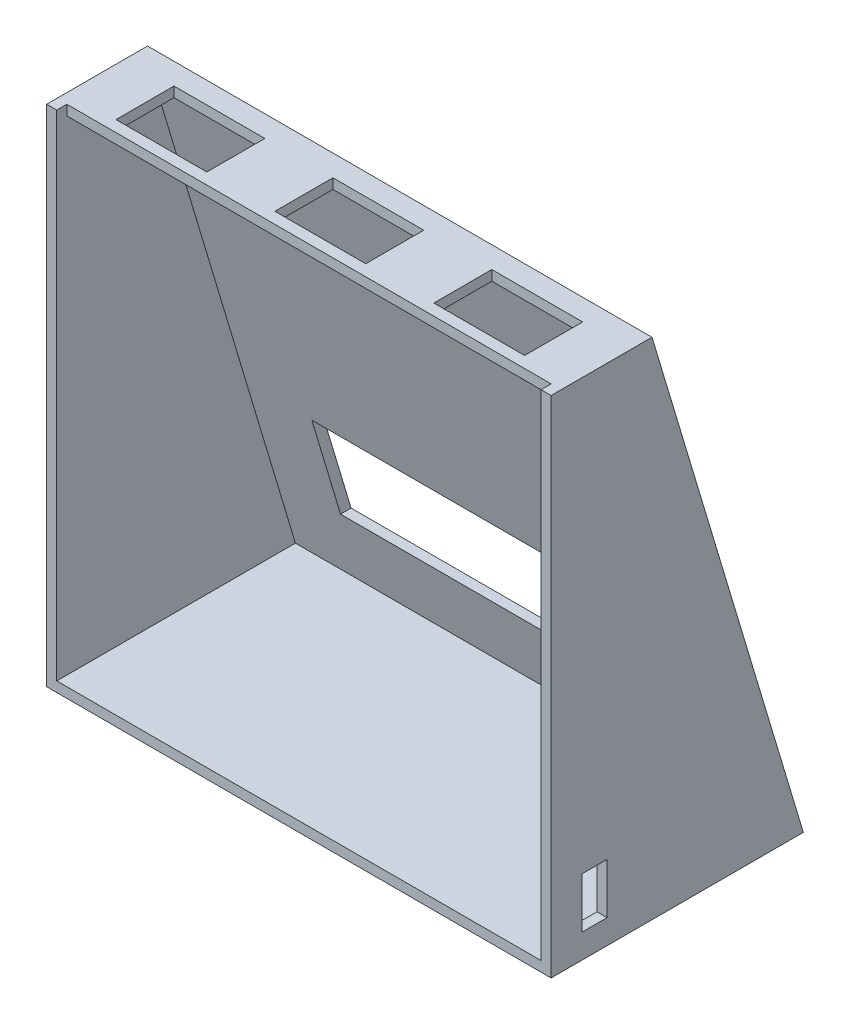
ISO-10303-21;
HEADER;
FILE_DESCRIPTION(('STEP AP214'),'2;1');
FILE_NAME('part.step','',(''),(''),'','','');
FILE_SCHEMA(('AUTOMOTIVE_DESIGN { 1 0 10303 214 1 1 1 1 }'));
ENDSEC;
DATA;
#1=APPLICATION_CONTEXT('core data for automotive mechanical design processes');
#2=APPLICATION_PROTOCOL_DEFINITION('international standard','automotive_design',2000,#1);
#3=PRODUCT_CONTEXT('',#1,'mechanical');
#4=PRODUCT('Part','Part','',(#3));
#5=PRODUCT_RELATED_PRODUCT_CATEGORY('part','',(#4));
#6=PRODUCT_DEFINITION_FORMATION('','',#4);
#7=PRODUCT_DEFINITION_CONTEXT('part definition',#1,'design');
#8=PRODUCT_DEFINITION('design','',#6,#7);
#9=PRODUCT_DEFINITION_SHAPE('','',#8);
#10=(LENGTH_UNIT() NAMED_UNIT(*) SI_UNIT(.MILLI.,.METRE.));
#11=(NAMED_UNIT(*) PLANE_ANGLE_UNIT() SI_UNIT($,.RADIAN.));
#12=(NAMED_UNIT(*) SI_UNIT($,.STERADIAN.) SOLID_ANGLE_UNIT());
#13=UNCERTAINTY_MEASURE_WITH_UNIT(LENGTH_MEASURE(1.E-05),#10,'distance_accuracy_value','');
#14=(GEOMETRIC_REPRESENTATION_CONTEXT(3) GLOBAL_UNCERTAINTY_ASSIGNED_CONTEXT((#13)) GLOBAL_UNIT_ASSIGNED_CONTEXT((#10,
#11,#12)) REPRESENTATION_CONTEXT('',''));
#15=CARTESIAN_POINT('',(0.,0.,0.));
#16=DIRECTION('',(0.,0.,1.));
#17=DIRECTION('',(1.,0.,0.));
#18=AXIS2_PLACEMENT_3D('',#15,#16,#17);
#19=CARTESIAN_POINT('',(2.,-45.8053691275168,-3.43440992544471));
#20=DIRECTION('',(0.,-0.287347885566346,0.957826285221151));
#21=DIRECTION('',(0.,-0.957826285221152,-0.287347885566346));
#22=AXIS2_PLACEMENT_3D('',#19,#20,#21);
#23=PLANE('',#22);
#24=DIRECTION('',(0.,0.957826285221151,0.287347885566346));
#25=VECTOR('',#24,1.);
#26=CARTESIAN_POINT('',(0.,-45.8053691275168,-3.43440992544471));
#27=LINE('',#26,#25);
#28=CARTESIAN_POINT('',(0.,-45.8053691275168,-3.43440992544471));
#29=VERTEX_POINT('',#28);
#30=CARTESIAN_POINT('',(0.,54.1946308724832,26.5655900745553));
#31=VERTEX_POINT('',#30);
#32=EDGE_CURVE('E450',#29,#31,#27,.T.);
#33=ORIENTED_EDGE('',*,*,#32,.T.);
#34=DIRECTION('',(-1.,0.,0.));
#35=VECTOR('',#34,1.);
#36=CARTESIAN_POINT('',(2.,54.1946308724832,26.5655900745553));
#37=LINE('',#36,#35);
#38=CARTESIAN_POINT('',(100.,54.1946308724832,26.5655900745553));
#39=VERTEX_POINT('',#38);
#40=EDGE_CURVE('E455',#39,#31,#37,.T.);
#41=ORIENTED_EDGE('',*,*,#40,.F.);
#42=DIRECTION('',(0.,0.957826285221151,0.287347885566346));
#43=VECTOR('',#42,1.);
#44=CARTESIAN_POINT('',(100.,54.1946308724832,26.5655900745553));
#45=LINE('',#44,#43);
#46=CARTESIAN_POINT('',(100.,-45.8053691275168,-3.43440992544471));
#47=VERTEX_POINT('',#46);
#48=EDGE_CURVE('E389',#47,#39,#45,.T.);
#49=ORIENTED_EDGE('',*,*,#48,.F.);
#50=DIRECTION('',(-1.,0.,0.));
#51=VECTOR('',#50,1.);
#52=CARTESIAN_POINT('',(2.,-45.8053691275168,-3.43440992544471));
#53=LINE('',#52,#51);
#54=EDGE_CURVE('E458',#47,#29,#53,.T.);
#55=ORIENTED_EDGE('',*,*,#54,.T.);
#56=EDGE_LOOP('',(#33,#41,#49,#55));
#57=FACE_BOUND('',#56,.T.);
#58=DIRECTION('',(0.,-0.957826285221152,-0.287347885566346));
#59=VECTOR('',#58,1.);
#60=CARTESIAN_POINT('',(85.,-45.8053691275168,-3.43440992544471));
#61=LINE('',#60,#59);
#62=CARTESIAN_POINT('',(85.,-11.3053691275168,6.91559007455529));
#63=VERTEX_POINT('',#62);
#64=CARTESIAN_POINT('',(85.,-30.3053691275168,1.21559007455529));
#65=VERTEX_POINT('',#64);
#66=EDGE_CURVE('E282',#63,#65,#61,.T.);
#67=ORIENTED_EDGE('',*,*,#66,.F.);
#68=DIRECTION('',(1.,0.,0.));
#69=VECTOR('',#68,1.);
#70=CARTESIAN_POINT('',(1.99999999999999,-11.3053691275168,6.91559007455529));
#71=LINE('',#70,#69);
#72=CARTESIAN_POINT('',(15.,-11.3053691275168,6.9155900745553));
#73=VERTEX_POINT('',#72);
#74=EDGE_CURVE('E280',#73,#63,#71,.T.);
#75=ORIENTED_EDGE('',*,*,#74,.F.);
#76=DIRECTION('',(0.,0.957826285221152,0.287347885566346));
#77=VECTOR('',#76,1.);
#78=CARTESIAN_POINT('',(15.,-45.8053691275168,-3.43440992544471));
#79=LINE('',#78,#77);
#80=CARTESIAN_POINT('',(15.,-30.3053691275168,1.21559007455529));
#81=VERTEX_POINT('',#80);
#82=EDGE_CURVE('E278',#81,#73,#79,.T.);
#83=ORIENTED_EDGE('',*,*,#82,.F.);
#84=DIRECTION('',(-1.,0.,0.));
#85=VECTOR('',#84,1.);
#86=CARTESIAN_POINT('',(2.,-30.3053691275168,1.21559007455529));
#87=LINE('',#86,#85);
#88=EDGE_CURVE('E276',#65,#81,#87,.T.);
#89=ORIENTED_EDGE('',*,*,#88,.F.);
#90=EDGE_LOOP('',(#67,#75,#83,#89));
#91=FACE_BOUND('',#90,.T.);
#92=ADVANCED_FACE('F33',(#57,#91),#23,.F.);
#93=CARTESIAN_POINT('',(98.,52.1946308724832,28.0536513763374));
#94=DIRECTION('',(0.,0.287347885566346,-0.957826285221151));
#95=DIRECTION('',(0.,0.957826285221151,0.287347885566346));
#96=AXIS2_PLACEMENT_3D('',#93,#94,#95);
#97=PLANE('',#96);
#98=DIRECTION('',(0.,-0.957826285221151,-0.287347885566346));
#99=VECTOR('',#98,1.);
#100=CARTESIAN_POINT('',(2.,52.1946308724832,28.0536513763374));
#101=LINE('',#100,#99);
#102=CARTESIAN_POINT('',(2.,52.1946308724832,28.0536513763374));
#103=VERTEX_POINT('',#102);
#104=CARTESIAN_POINT('',(2.,-43.8053691275168,-0.746348623662602));
#105=VERTEX_POINT('',#104);
#106=EDGE_CURVE('E417',#103,#105,#101,.T.);
#107=ORIENTED_EDGE('',*,*,#106,.T.);
#108=DIRECTION('',(-1.,0.,0.));
#109=VECTOR('',#108,1.);
#110=CARTESIAN_POINT('',(98.,-43.8053691275168,-0.746348623662602));
#111=LINE('',#110,#109);
#112=CARTESIAN_POINT('',(98.,-43.8053691275168,-0.746348623662602));
#113=VERTEX_POINT('',#112);
#114=EDGE_CURVE('E433',#113,#105,#111,.T.);
#115=ORIENTED_EDGE('',*,*,#114,.F.);
#116=DIRECTION('',(0.,-0.957826285221151,-0.287347885566346));
#117=VECTOR('',#116,1.);
#118=CARTESIAN_POINT('',(98.,52.1946308724832,28.0536513763374));
#119=LINE('',#118,#117);
#120=CARTESIAN_POINT('',(98.,52.1946308724832,28.0536513763374));
#121=VERTEX_POINT('',#120);
#122=EDGE_CURVE('E404',#121,#113,#119,.T.);
#123=ORIENTED_EDGE('',*,*,#122,.F.);
#124=DIRECTION('',(-1.,0.,0.));
#125=VECTOR('',#124,1.);
#126=CARTESIAN_POINT('',(98.,52.1946308724832,28.0536513763374));
#127=LINE('',#126,#125);
#128=EDGE_CURVE('E436',#121,#103,#127,.T.);
#129=ORIENTED_EDGE('',*,*,#128,.T.);
#130=EDGE_LOOP('',(#107,#115,#123,#129));
#131=FACE_BOUND('',#130,.T.);
#132=DIRECTION('',(0.,0.957826285221151,0.287347885566346));
#133=VECTOR('',#132,1.);
#134=CARTESIAN_POINT('',(85.,52.1946308724832,28.0536513763374));
#135=LINE('',#134,#133);
#136=CARTESIAN_POINT('',(85.,-30.3053691275168,3.3036513763374));
#137=VERTEX_POINT('',#136);
#138=CARTESIAN_POINT('',(85.,-11.3053691275168,9.0036513763374));
#139=VERTEX_POINT('',#138);
#140=EDGE_CURVE('E11',#137,#139,#135,.T.);
#141=ORIENTED_EDGE('',*,*,#140,.F.);
#142=DIRECTION('',(1.,0.,0.));
#143=VECTOR('',#142,1.);
#144=CARTESIAN_POINT('',(98.,-30.3053691275168,3.3036513763374));
#145=LINE('',#144,#143);
#146=CARTESIAN_POINT('',(15.,-30.3053691275168,3.3036513763374));
#147=VERTEX_POINT('',#146);
#148=EDGE_CURVE('E464',#147,#137,#145,.T.);
#149=ORIENTED_EDGE('',*,*,#148,.F.);
#150=DIRECTION('',(0.,-0.957826285221151,-0.287347885566346));
#151=VECTOR('',#150,1.);
#152=CARTESIAN_POINT('',(15.0000000000001,52.1946308724833,28.0536513763374));
#153=LINE('',#152,#151);
#154=CARTESIAN_POINT('',(15.,-11.3053691275168,9.00365137633739));
#155=VERTEX_POINT('',#154);
#156=EDGE_CURVE('E466',#155,#147,#153,.T.);
#157=ORIENTED_EDGE('',*,*,#156,.F.);
#158=DIRECTION('',(-1.,0.,0.));
#159=VECTOR('',#158,1.);
#160=CARTESIAN_POINT('',(98.,-11.3053691275168,9.0036513763374));
#161=LINE('',#160,#159);
#162=EDGE_CURVE('E41',#139,#155,#161,.T.);
#163=ORIENTED_EDGE('',*,*,#162,.F.);
#164=EDGE_LOOP('',(#141,#149,#157,#163));
#165=FACE_BOUND('',#164,.T.);
#166=ADVANCED_FACE('F481',(#131,#165),#97,.F.);
#167=CARTESIAN_POINT('',(2.,54.1946308724832,46.5655900745553));
#168=DIRECTION('',(0.,0.,-1.));
#169=DIRECTION('',(-1.,0.,0.));
#170=AXIS2_PLACEMENT_3D('',#167,#168,#169);
#171=PLANE('',#170);
#172=DIRECTION('',(0.,-1.,0.));
#173=VECTOR('',#172,1.);
#174=CARTESIAN_POINT('',(0.,54.1946308724832,46.5655900745553));
#175=LINE('',#174,#173);
#176=CARTESIAN_POINT('',(0.,54.1946308724832,46.5655900745553));
#177=VERTEX_POINT('',#176);
#178=CARTESIAN_POINT('',(0.,-45.8053691275168,46.5655900745553));
#179=VERTEX_POINT('',#178);
#180=EDGE_CURVE('E439',#177,#179,#175,.T.);
#181=ORIENTED_EDGE('',*,*,#180,.T.);
#182=DIRECTION('',(-1.,0.,0.));
#183=VECTOR('',#182,1.);
#184=CARTESIAN_POINT('',(2.,-45.8053691275168,46.5655900745553));
#185=LINE('',#184,#183);
#186=CARTESIAN_POINT('',(100.,-45.8053691275168,46.5655900745553));
#187=VERTEX_POINT('',#186);
#188=EDGE_CURVE('E461',#187,#179,#185,.T.);
#189=ORIENTED_EDGE('',*,*,#188,.F.);
#190=DIRECTION('',(0.,-1.,0.));
#191=VECTOR('',#190,1.);
#192=CARTESIAN_POINT('',(100.,-45.8053691275168,46.5655900745553));
#193=LINE('',#192,#191);
#194=CARTESIAN_POINT('',(100.,54.1946308724832,46.5655900745553));
#195=VERTEX_POINT('',#194);
#196=EDGE_CURVE('E382',#195,#187,#193,.T.);
#197=ORIENTED_EDGE('',*,*,#196,.F.);
#198=DIRECTION('',(-1.,0.,0.));
#199=VECTOR('',#198,1.);
#200=CARTESIAN_POINT('',(100.,54.1946308724832,46.5655900745553));
#201=LINE('',#200,#199);
#202=CARTESIAN_POINT('',(98.,54.1946308724832,46.5655900745553));
#203=VERTEX_POINT('',#202);
#204=EDGE_CURVE('E394',#195,#203,#201,.T.);
#205=ORIENTED_EDGE('',*,*,#204,.T.);
#206=DIRECTION('',(0.,-1.,0.));
#207=VECTOR('',#206,1.);
#208=CARTESIAN_POINT('',(98.,-45.8053691275168,46.5655900745553));
#209=LINE('',#208,#207);
#210=CARTESIAN_POINT('',(98.,-43.8053691275168,46.5655900745553));
#211=VERTEX_POINT('',#210);
#212=EDGE_CURVE('E376',#203,#211,#209,.T.);
#213=ORIENTED_EDGE('',*,*,#212,.T.);
#214=DIRECTION('',(-1.,0.,0.));
#215=VECTOR('',#214,1.);
#216=CARTESIAN_POINT('',(98.,-43.8053691275168,46.5655900745553));
#217=LINE('',#216,#215);
#218=CARTESIAN_POINT('',(2.,-43.8053691275168,46.5655900745553));
#219=VERTEX_POINT('',#218);
#220=EDGE_CURVE('E430',#211,#219,#217,.T.);
#221=ORIENTED_EDGE('',*,*,#220,.T.);
#222=DIRECTION('',(0.,-1.,0.));
#223=VECTOR('',#222,1.);
#224=CARTESIAN_POINT('',(2.,54.1946308724832,46.5655900745553));
#225=LINE('',#224,#223);
#226=CARTESIAN_POINT('',(2.,54.1946308724832,46.5655900745553));
#227=VERTEX_POINT('',#226);
#228=EDGE_CURVE('E440',#227,#219,#225,.T.);
#229=ORIENTED_EDGE('',*,*,#228,.F.);
#230=DIRECTION('',(-1.,0.,0.));
#231=VECTOR('',#230,1.);
#232=CARTESIAN_POINT('',(2.,54.1946308724832,46.5655900745553));
#233=LINE('',#232,#231);
#234=EDGE_CURVE('E445',#227,#177,#233,.T.);
#235=ORIENTED_EDGE('',*,*,#234,.T.);
#236=EDGE_LOOP('',(#181,#189,#197,#205,#213,#221,#229,#235));
#237=FACE_BOUND('',#236,.T.);
#238=ADVANCED_FACE('F35',(#237),#171,.F.);
#239=CARTESIAN_POINT('',(2.,-45.8053691275168,46.5655900745553));
#240=DIRECTION('',(0.,1.,0.));
#241=DIRECTION('',(0.,0.,1.));
#242=AXIS2_PLACEMENT_3D('',#239,#240,#241);
#243=PLANE('',#242);
#244=DIRECTION('',(0.,0.,-1.));
#245=VECTOR('',#244,1.);
#246=CARTESIAN_POINT('',(0.,-45.8053691275168,46.5655900745553));
#247=LINE('',#246,#245);
#248=EDGE_CURVE('E448',#179,#29,#247,.T.);
#249=ORIENTED_EDGE('',*,*,#248,.T.);
#250=ORIENTED_EDGE('',*,*,#54,.F.);
#251=DIRECTION('',(0.,0.,-1.));
#252=VECTOR('',#251,1.);
#253=CARTESIAN_POINT('',(100.,-45.8053691275168,-3.43440992544471));
#254=LINE('',#253,#252);
#255=EDGE_CURVE('E385',#187,#47,#254,.T.);
#256=ORIENTED_EDGE('',*,*,#255,.F.);
#257=ORIENTED_EDGE('',*,*,#188,.T.);
#258=EDGE_LOOP('',(#249,#250,#256,#257));
#259=FACE_BOUND('',#258,.T.);
#260=ADVANCED_FACE('F501',(#259),#243,.F.);
#261=CARTESIAN_POINT('',(2.,54.1946308724832,26.5655900745553));
#262=DIRECTION('',(0.,-1.,0.));
#263=DIRECTION('',(0.,0.,-1.));
#264=AXIS2_PLACEMENT_3D('',#261,#262,#263);
#265=PLANE('',#264);
#266=DIRECTION('',(0.,0.,1.));
#267=VECTOR('',#266,1.);
#268=CARTESIAN_POINT('',(9.50000000000002,54.1946308724832,42.3155900745553));
#269=LINE('',#268,#267);
#270=CARTESIAN_POINT('',(9.50000000000002,54.1946308724832,30.8155900745553));
#271=VERTEX_POINT('',#270);
#272=CARTESIAN_POINT('',(9.50000000000002,54.1946308724832,42.3155900745553));
#273=VERTEX_POINT('',#272);
#274=EDGE_CURVE('E335',#271,#273,#269,.T.);
#275=ORIENTED_EDGE('',*,*,#274,.F.);
#276=DIRECTION('',(-1.,0.,0.));
#277=VECTOR('',#276,1.);
#278=CARTESIAN_POINT('',(9.50000000000002,54.1946308724832,30.8155900745553));
#279=LINE('',#278,#277);
#280=CARTESIAN_POINT('',(27.5,54.1946308724832,30.8155900745553));
#281=VERTEX_POINT('',#280);
#282=EDGE_CURVE('E285',#281,#271,#279,.T.);
#283=ORIENTED_EDGE('',*,*,#282,.F.);
#284=DIRECTION('',(0.,0.,-1.));
#285=VECTOR('',#284,1.);
#286=CARTESIAN_POINT('',(27.5,54.1946308724832,30.8155900745553));
#287=LINE('',#286,#285);
#288=CARTESIAN_POINT('',(27.5,54.1946308724832,42.3155900745553));
#289=VERTEX_POINT('',#288);
#290=EDGE_CURVE('E324',#289,#281,#287,.T.);
#291=ORIENTED_EDGE('',*,*,#290,.F.);
#292=DIRECTION('',(1.,0.,0.));
#293=VECTOR('',#292,1.);
#294=CARTESIAN_POINT('',(27.5,54.1946308724832,42.3155900745553));
#295=LINE('',#294,#293);
#296=EDGE_CURVE('E338',#273,#289,#295,.T.);
#297=ORIENTED_EDGE('',*,*,#296,.F.);
#298=EDGE_LOOP('',(#275,#283,#291,#297));
#299=FACE_BOUND('',#298,.T.);
#300=DIRECTION('',(0.,0.,1.));
#301=VECTOR('',#300,1.);
#302=CARTESIAN_POINT('',(72.5,54.1946308724832,30.8155900745553));
#303=LINE('',#302,#301);
#304=CARTESIAN_POINT('',(72.5,54.1946308724832,30.8155900745553));
#305=VERTEX_POINT('',#304);
#306=CARTESIAN_POINT('',(72.5,54.1946308724832,42.3155900745553));
#307=VERTEX_POINT('',#306);
#308=EDGE_CURVE('E302',#305,#307,#303,.T.);
#309=ORIENTED_EDGE('',*,*,#308,.F.);
#310=DIRECTION('',(-1.,0.,0.));
#311=VECTOR('',#310,1.);
#312=CARTESIAN_POINT('',(90.5,54.1946308724832,30.8155900745553));
#313=LINE('',#312,#311);
#314=CARTESIAN_POINT('',(90.5,54.1946308724832,30.8155900745553));
#315=VERTEX_POINT('',#314);
#316=EDGE_CURVE('E300',#315,#305,#313,.T.);
#317=ORIENTED_EDGE('',*,*,#316,.F.);
#318=DIRECTION('',(0.,0.,-1.));
#319=VECTOR('',#318,1.);
#320=CARTESIAN_POINT('',(90.5,54.1946308724832,36.5655900745553));
#321=LINE('',#320,#319);
#322=CARTESIAN_POINT('',(90.5,54.1946308724832,42.3155900745553));
#323=VERTEX_POINT('',#322);
#324=EDGE_CURVE('E290',#323,#315,#321,.T.);
#325=ORIENTED_EDGE('',*,*,#324,.F.);
#326=DIRECTION('',(1.,0.,0.));
#327=VECTOR('',#326,1.);
#328=CARTESIAN_POINT('',(72.5,54.1946308724832,42.3155900745553));
#329=LINE('',#328,#327);
#330=EDGE_CURVE('E306',#307,#323,#329,.T.);
#331=ORIENTED_EDGE('',*,*,#330,.F.);
#332=EDGE_LOOP('',(#309,#317,#325,#331));
#333=FACE_BOUND('',#332,.T.);
#334=DIRECTION('',(0.,0.,1.));
#335=VECTOR('',#334,1.);
#336=CARTESIAN_POINT('',(41.,54.1946308724832,42.3155900745553));
#337=LINE('',#336,#335);
#338=CARTESIAN_POINT('',(41.,54.1946308724832,30.8155900745553));
#339=VERTEX_POINT('',#338);
#340=CARTESIAN_POINT('',(41.,54.1946308724832,42.3155900745553));
#341=VERTEX_POINT('',#340);
#342=EDGE_CURVE('E313',#339,#341,#337,.T.);
#343=ORIENTED_EDGE('',*,*,#342,.F.);
#344=DIRECTION('',(-1.,0.,0.));
#345=VECTOR('',#344,1.);
#346=CARTESIAN_POINT('',(50.,54.1946308724832,30.8155900745553));
#347=LINE('',#346,#345);
#348=CARTESIAN_POINT('',(59.,54.1946308724832,30.8155900745553));
#349=VERTEX_POINT('',#348);
#350=EDGE_CURVE('E354',#349,#339,#347,.T.);
#351=ORIENTED_EDGE('',*,*,#350,.F.);
#352=DIRECTION('',(0.,0.,-1.));
#353=VECTOR('',#352,1.);
#354=CARTESIAN_POINT('',(59.,54.1946308724832,30.8155900745553));
#355=LINE('',#354,#353);
#356=CARTESIAN_POINT('',(59.,54.1946308724832,42.3155900745553));
#357=VERTEX_POINT('',#356);
#358=EDGE_CURVE('E369',#357,#349,#355,.T.);
#359=ORIENTED_EDGE('',*,*,#358,.F.);
#360=DIRECTION('',(1.,0.,0.));
#361=VECTOR('',#360,1.);
#362=CARTESIAN_POINT('',(59.,54.1946308724832,42.3155900745553));
#363=LINE('',#362,#361);
#364=EDGE_CURVE('E366',#341,#357,#363,.T.);
#365=ORIENTED_EDGE('',*,*,#364,.F.);
#366=EDGE_LOOP('',(#343,#351,#359,#365));
#367=FACE_BOUND('',#366,.T.);
#368=DIRECTION('',(0.,0.,1.));
#369=VECTOR('',#368,1.);
#370=CARTESIAN_POINT('',(0.,54.1946308724832,26.5655900745553));
#371=LINE('',#370,#369);
#372=EDGE_CURVE('E443',#31,#177,#371,.T.);
#373=ORIENTED_EDGE('',*,*,#372,.T.);
#374=ORIENTED_EDGE('',*,*,#234,.F.);
#375=DIRECTION('',(0.,0.,1.));
#376=VECTOR('',#375,1.);
#377=CARTESIAN_POINT('',(2.,54.1946308724832,26.5655900745553));
#378=LINE('',#377,#376);
#379=CARTESIAN_POINT('',(2.,54.1946308724832,44.5655900745553));
#380=VERTEX_POINT('',#379);
#381=EDGE_CURVE('E442',#380,#227,#378,.T.);
#382=ORIENTED_EDGE('',*,*,#381,.F.);
#383=DIRECTION('',(-1.,0.,0.));
#384=VECTOR('',#383,1.);
#385=CARTESIAN_POINT('',(98.,54.1946308724832,44.5655900745553));
#386=LINE('',#385,#384);
#387=CARTESIAN_POINT('',(98.,54.1946308724832,44.5655900745553));
#388=VERTEX_POINT('',#387);
#389=EDGE_CURVE('E427',#388,#380,#386,.T.);
#390=ORIENTED_EDGE('',*,*,#389,.F.);
#391=DIRECTION('',(0.,0.,1.));
#392=VECTOR('',#391,1.);
#393=CARTESIAN_POINT('',(98.,54.1946308724832,46.5655900745553));
#394=LINE('',#393,#392);
#395=EDGE_CURVE('E386',#388,#203,#394,.T.);
#396=ORIENTED_EDGE('',*,*,#395,.T.);
#397=ORIENTED_EDGE('',*,*,#204,.F.);
#398=DIRECTION('',(0.,0.,1.));
#399=VECTOR('',#398,1.);
#400=CARTESIAN_POINT('',(100.,54.1946308724832,46.5655900745553));
#401=LINE('',#400,#399);
#402=EDGE_CURVE('E392',#39,#195,#401,.T.);
#403=ORIENTED_EDGE('',*,*,#402,.F.);
#404=ORIENTED_EDGE('',*,*,#40,.T.);
#405=EDGE_LOOP('',(#373,#374,#382,#390,#396,#397,#403,#404));
#406=FACE_BOUND('',#405,.T.);
#407=ADVANCED_FACE('F499',(#299,#333,#367,#406),#265,.F.);
#408=CARTESIAN_POINT('',(2.,0.,0.));
#409=DIRECTION('',(1.,0.,0.));
#410=DIRECTION('',(0.,0.,-1.));
#411=AXIS2_PLACEMENT_3D('',#408,#409,#410);
#412=PLANE('',#411);
#413=DIRECTION('',(0.,-1.,0.));
#414=VECTOR('',#413,1.);
#415=CARTESIAN_POINT('',(2.,54.1946308724832,44.5655900745553));
#416=LINE('',#415,#414);
#417=CARTESIAN_POINT('',(2.,52.1946308724832,44.5655900745553));
#418=VERTEX_POINT('',#417);
#419=EDGE_CURVE('E405',#380,#418,#416,.T.);
#420=ORIENTED_EDGE('',*,*,#419,.F.);
#421=ORIENTED_EDGE('',*,*,#381,.T.);
#422=ORIENTED_EDGE('',*,*,#228,.T.);
#423=DIRECTION('',(0.,0.,1.));
#424=VECTOR('',#423,1.);
#425=CARTESIAN_POINT('',(2.,-43.8053691275168,44.5655900745553));
#426=LINE('',#425,#424);
#427=EDGE_CURVE('E420',#105,#219,#426,.T.);
#428=ORIENTED_EDGE('',*,*,#427,.F.);
#429=ORIENTED_EDGE('',*,*,#106,.F.);
#430=DIRECTION('',(0.,0.,-1.));
#431=VECTOR('',#430,1.);
#432=CARTESIAN_POINT('',(2.,52.1946308724832,44.5655900745553));
#433=LINE('',#432,#431);
#434=EDGE_CURVE('E400',#418,#103,#433,.T.);
#435=ORIENTED_EDGE('',*,*,#434,.F.);
#436=EDGE_LOOP('',(#420,#421,#422,#428,#429,#435));
#437=FACE_BOUND('',#436,.T.);
#438=ADVANCED_FACE('F508',(#437),#412,.T.);
#439=CARTESIAN_POINT('',(0.,0.,0.));
#440=DIRECTION('',(1.,0.,0.));
#441=DIRECTION('',(0.,0.,-1.));
#442=AXIS2_PLACEMENT_3D('',#439,#440,#441);
#443=PLANE('',#442);
#444=ORIENTED_EDGE('',*,*,#180,.F.);
#445=ORIENTED_EDGE('',*,*,#372,.F.);
#446=ORIENTED_EDGE('',*,*,#32,.F.);
#447=ORIENTED_EDGE('',*,*,#248,.F.);
#448=EDGE_LOOP('',(#444,#445,#446,#447));
#449=FACE_BOUND('',#448,.T.);
#450=ADVANCED_FACE('F517',(#449),#443,.F.);
#451=CARTESIAN_POINT('',(98.,52.1946308724832,44.5655900745553));
#452=DIRECTION('',(0.,1.,0.));
#453=DIRECTION('',(0.,0.,1.));
#454=AXIS2_PLACEMENT_3D('',#451,#452,#453);
#455=PLANE('',#454);
#456=DIRECTION('',(0.,0.,-1.));
#457=VECTOR('',#456,1.);
#458=CARTESIAN_POINT('',(27.5,52.1946308724832,30.8155900745553));
#459=LINE('',#458,#457);
#460=CARTESIAN_POINT('',(27.5,52.1946308724832,42.3155900745553));
#461=VERTEX_POINT('',#460);
#462=CARTESIAN_POINT('',(27.5,52.1946308724832,30.8155900745553));
#463=VERTEX_POINT('',#462);
#464=EDGE_CURVE('E330',#461,#463,#459,.T.);
#465=ORIENTED_EDGE('',*,*,#464,.T.);
#466=DIRECTION('',(-1.,0.,0.));
#467=VECTOR('',#466,1.);
#468=CARTESIAN_POINT('',(9.50000000000002,52.1946308724832,30.8155900745553));
#469=LINE('',#468,#467);
#470=CARTESIAN_POINT('',(9.50000000000002,52.1946308724832,30.8155900745553));
#471=VERTEX_POINT('',#470);
#472=EDGE_CURVE('E320',#463,#471,#469,.T.);
#473=ORIENTED_EDGE('',*,*,#472,.T.);
#474=DIRECTION('',(0.,0.,1.));
#475=VECTOR('',#474,1.);
#476=CARTESIAN_POINT('',(9.50000000000002,52.1946308724832,36.5655900745553));
#477=LINE('',#476,#475);
#478=CARTESIAN_POINT('',(9.50000000000002,52.1946308724832,42.3155900745553));
#479=VERTEX_POINT('',#478);
#480=EDGE_CURVE('E323',#471,#479,#477,.T.);
#481=ORIENTED_EDGE('',*,*,#480,.T.);
#482=DIRECTION('',(1.,0.,0.));
#483=VECTOR('',#482,1.);
#484=CARTESIAN_POINT('',(27.5,52.1946308724832,42.3155900745553));
#485=LINE('',#484,#483);
#486=EDGE_CURVE('E327',#479,#461,#485,.T.);
#487=ORIENTED_EDGE('',*,*,#486,.T.);
#488=EDGE_LOOP('',(#465,#473,#481,#487));
#489=FACE_BOUND('',#488,.T.);
#490=DIRECTION('',(0.,0.,-1.));
#491=VECTOR('',#490,1.);
#492=CARTESIAN_POINT('',(90.5,52.1946308724832,42.3155900745553));
#493=LINE('',#492,#491);
#494=CARTESIAN_POINT('',(90.5,52.1946308724832,42.3155900745553));
#495=VERTEX_POINT('',#494);
#496=CARTESIAN_POINT('',(90.5,52.1946308724832,30.8155900745553));
#497=VERTEX_POINT('',#496);
#498=EDGE_CURVE('E296',#495,#497,#493,.T.);
#499=ORIENTED_EDGE('',*,*,#498,.T.);
#500=DIRECTION('',(-1.,0.,0.));
#501=VECTOR('',#500,1.);
#502=CARTESIAN_POINT('',(90.5,52.1946308724832,30.8155900745553));
#503=LINE('',#502,#501);
#504=CARTESIAN_POINT('',(72.5,52.1946308724832,30.8155900745553));
#505=VERTEX_POINT('',#504);
#506=EDGE_CURVE('E286',#497,#505,#503,.T.);
#507=ORIENTED_EDGE('',*,*,#506,.T.);
#508=DIRECTION('',(0.,0.,1.));
#509=VECTOR('',#508,1.);
#510=CARTESIAN_POINT('',(72.5,52.1946308724832,30.8155900745553));
#511=LINE('',#510,#509);
#512=CARTESIAN_POINT('',(72.5,52.1946308724832,42.3155900745553));
#513=VERTEX_POINT('',#512);
#514=EDGE_CURVE('E289',#505,#513,#511,.T.);
#515=ORIENTED_EDGE('',*,*,#514,.T.);
#516=DIRECTION('',(1.,0.,0.));
#517=VECTOR('',#516,1.);
#518=CARTESIAN_POINT('',(72.5,52.1946308724832,42.3155900745553));
#519=LINE('',#518,#517);
#520=EDGE_CURVE('E293',#513,#495,#519,.T.);
#521=ORIENTED_EDGE('',*,*,#520,.T.);
#522=EDGE_LOOP('',(#499,#507,#515,#521));
#523=FACE_BOUND('',#522,.T.);
#524=DIRECTION('',(0.,0.,-1.));
#525=VECTOR('',#524,1.);
#526=CARTESIAN_POINT('',(59.,52.1946308724832,36.5655900745553));
#527=LINE('',#526,#525);
#528=CARTESIAN_POINT('',(59.,52.1946308724832,42.3155900745553));
#529=VERTEX_POINT('',#528);
#530=CARTESIAN_POINT('',(59.,52.1946308724832,30.8155900745553));
#531=VERTEX_POINT('',#530);
#532=EDGE_CURVE('E360',#529,#531,#527,.T.);
#533=ORIENTED_EDGE('',*,*,#532,.T.);
#534=DIRECTION('',(-1.,0.,0.));
#535=VECTOR('',#534,1.);
#536=CARTESIAN_POINT('',(41.,52.1946308724832,30.8155900745553));
#537=LINE('',#536,#535);
#538=CARTESIAN_POINT('',(41.,52.1946308724832,30.8155900745553));
#539=VERTEX_POINT('',#538);
#540=EDGE_CURVE('E350',#531,#539,#537,.T.);
#541=ORIENTED_EDGE('',*,*,#540,.T.);
#542=DIRECTION('',(0.,0.,1.));
#543=VECTOR('',#542,1.);
#544=CARTESIAN_POINT('',(41.,52.1946308724832,42.3155900745553));
#545=LINE('',#544,#543);
#546=CARTESIAN_POINT('',(41.,52.1946308724832,42.3155900745553));
#547=VERTEX_POINT('',#546);
#548=EDGE_CURVE('E353',#539,#547,#545,.T.);
#549=ORIENTED_EDGE('',*,*,#548,.T.);
#550=DIRECTION('',(1.,0.,0.));
#551=VECTOR('',#550,1.);
#552=CARTESIAN_POINT('',(59.,52.1946308724832,42.3155900745553));
#553=LINE('',#552,#551);
#554=EDGE_CURVE('E357',#547,#529,#553,.T.);
#555=ORIENTED_EDGE('',*,*,#554,.T.);
#556=EDGE_LOOP('',(#533,#541,#549,#555));
#557=FACE_BOUND('',#556,.T.);
#558=ORIENTED_EDGE('',*,*,#434,.T.);
#559=ORIENTED_EDGE('',*,*,#128,.F.);
#560=DIRECTION('',(0.,0.,-1.));
#561=VECTOR('',#560,1.);
#562=CARTESIAN_POINT('',(98.,52.1946308724832,44.5655900745553));
#563=LINE('',#562,#561);
#564=CARTESIAN_POINT('',(98.,52.1946308724832,44.5655900745553));
#565=VERTEX_POINT('',#564);
#566=EDGE_CURVE('E401',#565,#121,#563,.T.);
#567=ORIENTED_EDGE('',*,*,#566,.F.);
#568=DIRECTION('',(-1.,0.,0.));
#569=VECTOR('',#568,1.);
#570=CARTESIAN_POINT('',(98.,52.1946308724832,44.5655900745553));
#571=LINE('',#570,#569);
#572=EDGE_CURVE('E414',#565,#418,#571,.T.);
#573=ORIENTED_EDGE('',*,*,#572,.T.);
#574=EDGE_LOOP('',(#558,#559,#567,#573));
#575=FACE_BOUND('',#574,.T.);
#576=ADVANCED_FACE('F533',(#489,#523,#557,#575),#455,.F.);
#577=CARTESIAN_POINT('',(98.,-43.8053691275168,44.5655900745553));
#578=DIRECTION('',(0.,-1.,0.));
#579=DIRECTION('',(0.,0.,-1.));
#580=AXIS2_PLACEMENT_3D('',#577,#578,#579);
#581=PLANE('',#580);
#582=ORIENTED_EDGE('',*,*,#427,.T.);
#583=ORIENTED_EDGE('',*,*,#220,.F.);
#584=DIRECTION('',(0.,0.,1.));
#585=VECTOR('',#584,1.);
#586=CARTESIAN_POINT('',(98.,-43.8053691275168,44.5655900745553));
#587=LINE('',#586,#585);
#588=EDGE_CURVE('E408',#113,#211,#587,.T.);
#589=ORIENTED_EDGE('',*,*,#588,.F.);
#590=ORIENTED_EDGE('',*,*,#114,.T.);
#591=EDGE_LOOP('',(#582,#583,#589,#590));
#592=FACE_BOUND('',#591,.T.);
#593=ADVANCED_FACE('F525',(#592),#581,.F.);
#594=CARTESIAN_POINT('',(98.,54.1946308724832,44.5655900745553));
#595=DIRECTION('',(0.,0.,-1.));
#596=DIRECTION('',(-1.,0.,0.));
#597=AXIS2_PLACEMENT_3D('',#594,#595,#596);
#598=PLANE('',#597);
#599=ORIENTED_EDGE('',*,*,#419,.T.);
#600=ORIENTED_EDGE('',*,*,#572,.F.);
#601=DIRECTION('',(0.,-1.,0.));
#602=VECTOR('',#601,1.);
#603=CARTESIAN_POINT('',(98.,54.1946308724832,44.5655900745553));
#604=LINE('',#603,#602);
#605=EDGE_CURVE('E411',#388,#565,#604,.T.);
#606=ORIENTED_EDGE('',*,*,#605,.F.);
#607=ORIENTED_EDGE('',*,*,#389,.T.);
#608=EDGE_LOOP('',(#599,#600,#606,#607));
#609=FACE_BOUND('',#608,.T.);
#610=ADVANCED_FACE('F531',(#609),#598,.F.);
#611=CARTESIAN_POINT('',(100.,0.,0.));
#612=DIRECTION('',(-1.,0.,0.));
#613=DIRECTION('',(0.,0.,1.));
#614=AXIS2_PLACEMENT_3D('',#611,#612,#613);
#615=PLANE('',#614);
#616=DIRECTION('',(0.,0.,-1.));
#617=VECTOR('',#616,1.);
#618=CARTESIAN_POINT('',(100.,-40.9872567726078,35.4829306484447));
#619=LINE('',#618,#617);
#620=CARTESIAN_POINT('',(100.,-40.9872567726078,40.4829306484447));
#621=VERTEX_POINT('',#620);
#622=CARTESIAN_POINT('',(100.,-40.9872567726078,35.4829306484447));
#623=VERTEX_POINT('',#622);
#624=EDGE_CURVE('E256',#621,#623,#619,.T.);
#625=ORIENTED_EDGE('',*,*,#624,.F.);
#626=DIRECTION('',(0.,-1.,0.));
#627=VECTOR('',#626,1.);
#628=CARTESIAN_POINT('',(100.,-40.9872567726078,40.4829306484447));
#629=LINE('',#628,#627);
#630=CARTESIAN_POINT('',(100.,-30.9872567726078,40.4829306484447));
#631=VERTEX_POINT('',#630);
#632=EDGE_CURVE('E48',#631,#621,#629,.T.);
#633=ORIENTED_EDGE('',*,*,#632,.F.);
#634=DIRECTION('',(0.,0.,1.));
#635=VECTOR('',#634,1.);
#636=CARTESIAN_POINT('',(100.,-30.9872567726078,40.4829306484447));
#637=LINE('',#636,#635);
#638=CARTESIAN_POINT('',(100.,-30.9872567726078,35.4829306484447));
#639=VERTEX_POINT('',#638);
#640=EDGE_CURVE('E247',#639,#631,#637,.T.);
#641=ORIENTED_EDGE('',*,*,#640,.F.);
#642=DIRECTION('',(0.,1.,0.));
#643=VECTOR('',#642,1.);
#644=CARTESIAN_POINT('',(100.,-30.9872567726078,35.4829306484447));
#645=LINE('',#644,#643);
#646=EDGE_CURVE('E250',#623,#639,#645,.T.);
#647=ORIENTED_EDGE('',*,*,#646,.F.);
#648=EDGE_LOOP('',(#625,#633,#641,#647));
#649=FACE_BOUND('',#648,.T.);
#650=ORIENTED_EDGE('',*,*,#196,.T.);
#651=ORIENTED_EDGE('',*,*,#255,.T.);
#652=ORIENTED_EDGE('',*,*,#48,.T.);
#653=ORIENTED_EDGE('',*,*,#402,.T.);
#654=EDGE_LOOP('',(#650,#651,#652,#653));
#655=FACE_BOUND('',#654,.T.);
#656=ADVANCED_FACE('F539',(#649,#655),#615,.F.);
#657=CARTESIAN_POINT('',(98.,0.,0.));
#658=DIRECTION('',(-1.,0.,0.));
#659=DIRECTION('',(0.,0.,1.));
#660=AXIS2_PLACEMENT_3D('',#657,#658,#659);
#661=PLANE('',#660);
#662=DIRECTION('',(0.,-1.,0.));
#663=VECTOR('',#662,1.);
#664=CARTESIAN_POINT('',(98.,-40.9872567726078,40.4829306484447));
#665=LINE('',#664,#663);
#666=CARTESIAN_POINT('',(98.,-30.9872567726078,40.4829306484447));
#667=VERTEX_POINT('',#666);
#668=CARTESIAN_POINT('',(98.,-40.9872567726078,40.4829306484447));
#669=VERTEX_POINT('',#668);
#670=EDGE_CURVE('E231',#667,#669,#665,.T.);
#671=ORIENTED_EDGE('',*,*,#670,.T.);
#672=DIRECTION('',(0.,0.,-1.));
#673=VECTOR('',#672,1.);
#674=CARTESIAN_POINT('',(98.,-40.9872567726078,35.4829306484447));
#675=LINE('',#674,#673);
#676=CARTESIAN_POINT('',(98.,-40.9872567726078,35.4829306484447));
#677=VERTEX_POINT('',#676);
#678=EDGE_CURVE('E240',#669,#677,#675,.T.);
#679=ORIENTED_EDGE('',*,*,#678,.T.);
#680=DIRECTION('',(0.,1.,0.));
#681=VECTOR('',#680,1.);
#682=CARTESIAN_POINT('',(98.,-30.9872567726078,35.4829306484447));
#683=LINE('',#682,#681);
#684=CARTESIAN_POINT('',(98.,-30.9872567726078,35.4829306484447));
#685=VERTEX_POINT('',#684);
#686=EDGE_CURVE('E56',#677,#685,#683,.T.);
#687=ORIENTED_EDGE('',*,*,#686,.T.);
#688=DIRECTION('',(0.,0.,1.));
#689=VECTOR('',#688,1.);
#690=CARTESIAN_POINT('',(98.,-30.9872567726078,40.4829306484447));
#691=LINE('',#690,#689);
#692=EDGE_CURVE('E237',#685,#667,#691,.T.);
#693=ORIENTED_EDGE('',*,*,#692,.T.);
#694=EDGE_LOOP('',(#671,#679,#687,#693));
#695=FACE_BOUND('',#694,.T.);
#696=ORIENTED_EDGE('',*,*,#122,.T.);
#697=ORIENTED_EDGE('',*,*,#588,.T.);
#698=ORIENTED_EDGE('',*,*,#212,.F.);
#699=ORIENTED_EDGE('',*,*,#395,.F.);
#700=ORIENTED_EDGE('',*,*,#605,.T.);
#701=ORIENTED_EDGE('',*,*,#566,.T.);
#702=EDGE_LOOP('',(#696,#697,#698,#699,#700,#701));
#703=FACE_BOUND('',#702,.T.);
#704=ADVANCED_FACE('F244',(#695,#703),#661,.T.);
#705=CARTESIAN_POINT('',(50.,52.1946308724832,30.8155900745553));
#706=DIRECTION('',(0.,0.,-1.));
#707=DIRECTION('',(-1.,0.,0.));
#708=AXIS2_PLACEMENT_3D('',#705,#706,#707);
#709=PLANE('',#708);
#710=ORIENTED_EDGE('',*,*,#350,.T.);
#711=DIRECTION('',(0.,1.,0.));
#712=VECTOR('',#711,1.);
#713=CARTESIAN_POINT('',(41.,52.1946308724832,30.8155900745553));
#714=LINE('',#713,#712);
#715=EDGE_CURVE('E363',#539,#339,#714,.T.);
#716=ORIENTED_EDGE('',*,*,#715,.F.);
#717=ORIENTED_EDGE('',*,*,#540,.F.);
#718=DIRECTION('',(0.,1.,0.));
#719=VECTOR('',#718,1.);
#720=CARTESIAN_POINT('',(59.,52.1946308724832,30.8155900745553));
#721=LINE('',#720,#719);
#722=EDGE_CURVE('E374',#531,#349,#721,.T.);
#723=ORIENTED_EDGE('',*,*,#722,.T.);
#724=EDGE_LOOP('',(#710,#716,#717,#723));
#725=FACE_BOUND('',#724,.T.);
#726=ADVANCED_FACE('F547',(#725),#709,.F.);
#727=CARTESIAN_POINT('',(59.,52.1946308724832,30.8155900745553));
#728=DIRECTION('',(1.,0.,0.));
#729=DIRECTION('',(0.,0.,-1.));
#730=AXIS2_PLACEMENT_3D('',#727,#728,#729);
#731=PLANE('',#730);
#732=ORIENTED_EDGE('',*,*,#358,.T.);
#733=ORIENTED_EDGE('',*,*,#722,.F.);
#734=ORIENTED_EDGE('',*,*,#532,.F.);
#735=DIRECTION('',(0.,1.,0.));
#736=VECTOR('',#735,1.);
#737=CARTESIAN_POINT('',(59.,52.1946308724832,42.3155900745553));
#738=LINE('',#737,#736);
#739=EDGE_CURVE('E377',#529,#357,#738,.T.);
#740=ORIENTED_EDGE('',*,*,#739,.T.);
#741=EDGE_LOOP('',(#732,#733,#734,#740));
#742=FACE_BOUND('',#741,.T.);
#743=ADVANCED_FACE('F613',(#742),#731,.F.);
#744=CARTESIAN_POINT('',(59.,52.1946308724832,42.3155900745553));
#745=DIRECTION('',(0.,0.,1.));
#746=DIRECTION('',(1.,0.,0.));
#747=AXIS2_PLACEMENT_3D('',#744,#745,#746);
#748=PLANE('',#747);
#749=ORIENTED_EDGE('',*,*,#364,.T.);
#750=ORIENTED_EDGE('',*,*,#739,.F.);
#751=ORIENTED_EDGE('',*,*,#554,.F.);
#752=DIRECTION('',(0.,1.,0.));
#753=VECTOR('',#752,1.);
#754=CARTESIAN_POINT('',(41.,52.1946308724832,42.3155900745553));
#755=LINE('',#754,#753);
#756=EDGE_CURVE('E379',#547,#341,#755,.T.);
#757=ORIENTED_EDGE('',*,*,#756,.T.);
#758=EDGE_LOOP('',(#749,#750,#751,#757));
#759=FACE_BOUND('',#758,.T.);
#760=ADVANCED_FACE('F625',(#759),#748,.F.);
#761=CARTESIAN_POINT('',(41.,52.1946308724832,42.3155900745553));
#762=DIRECTION('',(-1.,0.,0.));
#763=DIRECTION('',(0.,0.,1.));
#764=AXIS2_PLACEMENT_3D('',#761,#762,#763);
#765=PLANE('',#764);
#766=ORIENTED_EDGE('',*,*,#342,.T.);
#767=ORIENTED_EDGE('',*,*,#756,.F.);
#768=ORIENTED_EDGE('',*,*,#548,.F.);
#769=ORIENTED_EDGE('',*,*,#715,.T.);
#770=EDGE_LOOP('',(#766,#767,#768,#769));
#771=FACE_BOUND('',#770,.T.);
#772=ADVANCED_FACE('F551',(#771),#765,.F.);
#773=CARTESIAN_POINT('',(90.5,52.1946308724832,30.8155900745553));
#774=DIRECTION('',(0.,0.,-1.));
#775=DIRECTION('',(-1.,0.,0.));
#776=AXIS2_PLACEMENT_3D('',#773,#774,#775);
#777=PLANE('',#776);
#778=ORIENTED_EDGE('',*,*,#316,.T.);
#779=DIRECTION('',(0.,1.,0.));
#780=VECTOR('',#779,1.);
#781=CARTESIAN_POINT('',(72.5,52.1946308724832,30.8155900745553));
#782=LINE('',#781,#780);
#783=EDGE_CURVE('E299',#505,#305,#782,.T.);
#784=ORIENTED_EDGE('',*,*,#783,.F.);
#785=ORIENTED_EDGE('',*,*,#506,.F.);
#786=DIRECTION('',(0.,1.,0.));
#787=VECTOR('',#786,1.);
#788=CARTESIAN_POINT('',(90.5,52.1946308724832,30.8155900745553));
#789=LINE('',#788,#787);
#790=EDGE_CURVE('E311',#497,#315,#789,.T.);
#791=ORIENTED_EDGE('',*,*,#790,.T.);
#792=EDGE_LOOP('',(#778,#784,#785,#791));
#793=FACE_BOUND('',#792,.T.);
#794=ADVANCED_FACE('F644',(#793),#777,.F.);
#795=CARTESIAN_POINT('',(90.5,52.1946308724832,36.5655900745553));
#796=DIRECTION('',(1.,0.,0.));
#797=DIRECTION('',(0.,0.,-1.));
#798=AXIS2_PLACEMENT_3D('',#795,#796,#797);
#799=PLANE('',#798);
#800=ORIENTED_EDGE('',*,*,#324,.T.);
#801=ORIENTED_EDGE('',*,*,#790,.F.);
#802=ORIENTED_EDGE('',*,*,#498,.F.);
#803=DIRECTION('',(0.,1.,0.));
#804=VECTOR('',#803,1.);
#805=CARTESIAN_POINT('',(90.5,52.1946308724832,42.3155900745553));
#806=LINE('',#805,#804);
#807=EDGE_CURVE('E314',#495,#323,#806,.T.);
#808=ORIENTED_EDGE('',*,*,#807,.T.);
#809=EDGE_LOOP('',(#800,#801,#802,#808));
#810=FACE_BOUND('',#809,.T.);
#811=ADVANCED_FACE('F652',(#810),#799,.F.);
#812=CARTESIAN_POINT('',(72.5,52.1946308724832,42.3155900745553));
#813=DIRECTION('',(0.,0.,1.));
#814=DIRECTION('',(1.,0.,0.));
#815=AXIS2_PLACEMENT_3D('',#812,#813,#814);
#816=PLANE('',#815);
#817=ORIENTED_EDGE('',*,*,#330,.T.);
#818=ORIENTED_EDGE('',*,*,#807,.F.);
#819=ORIENTED_EDGE('',*,*,#520,.F.);
#820=DIRECTION('',(0.,1.,0.));
#821=VECTOR('',#820,1.);
#822=CARTESIAN_POINT('',(72.5,52.1946308724832,42.3155900745553));
#823=LINE('',#822,#821);
#824=EDGE_CURVE('E316',#513,#307,#823,.T.);
#825=ORIENTED_EDGE('',*,*,#824,.T.);
#826=EDGE_LOOP('',(#817,#818,#819,#825));
#827=FACE_BOUND('',#826,.T.);
#828=ADVANCED_FACE('F661',(#827),#816,.F.);
#829=CARTESIAN_POINT('',(72.5,52.1946308724832,30.8155900745553));
#830=DIRECTION('',(-1.,0.,0.));
#831=DIRECTION('',(0.,0.,1.));
#832=AXIS2_PLACEMENT_3D('',#829,#830,#831);
#833=PLANE('',#832);
#834=ORIENTED_EDGE('',*,*,#308,.T.);
#835=ORIENTED_EDGE('',*,*,#824,.F.);
#836=ORIENTED_EDGE('',*,*,#514,.F.);
#837=ORIENTED_EDGE('',*,*,#783,.T.);
#838=EDGE_LOOP('',(#834,#835,#836,#837));
#839=FACE_BOUND('',#838,.T.);
#840=ADVANCED_FACE('F673',(#839),#833,.F.);
#841=CARTESIAN_POINT('',(9.50000000000002,52.1946308724832,30.8155900745553));
#842=DIRECTION('',(0.,0.,-1.));
#843=DIRECTION('',(-1.,0.,0.));
#844=AXIS2_PLACEMENT_3D('',#841,#842,#843);
#845=PLANE('',#844);
#846=ORIENTED_EDGE('',*,*,#282,.T.);
#847=DIRECTION('',(0.,1.,0.));
#848=VECTOR('',#847,1.);
#849=CARTESIAN_POINT('',(9.50000000000002,52.1946308724832,30.8155900745553));
#850=LINE('',#849,#848);
#851=EDGE_CURVE('E333',#471,#271,#850,.T.);
#852=ORIENTED_EDGE('',*,*,#851,.F.);
#853=ORIENTED_EDGE('',*,*,#472,.F.);
#854=DIRECTION('',(0.,1.,0.));
#855=VECTOR('',#854,1.);
#856=CARTESIAN_POINT('',(27.5,52.1946308724832,30.8155900745553));
#857=LINE('',#856,#855);
#858=EDGE_CURVE('E303',#463,#281,#857,.T.);
#859=ORIENTED_EDGE('',*,*,#858,.T.);
#860=EDGE_LOOP('',(#846,#852,#853,#859));
#861=FACE_BOUND('',#860,.T.);
#862=ADVANCED_FACE('F682',(#861),#845,.F.);
#863=CARTESIAN_POINT('',(27.5,52.1946308724832,30.8155900745553));
#864=DIRECTION('',(1.,0.,0.));
#865=DIRECTION('',(0.,0.,-1.));
#866=AXIS2_PLACEMENT_3D('',#863,#864,#865);
#867=PLANE('',#866);
#868=ORIENTED_EDGE('',*,*,#290,.T.);
#869=ORIENTED_EDGE('',*,*,#858,.F.);
#870=ORIENTED_EDGE('',*,*,#464,.F.);
#871=DIRECTION('',(0.,1.,0.));
#872=VECTOR('',#871,1.);
#873=CARTESIAN_POINT('',(27.5,52.1946308724832,42.3155900745553));
#874=LINE('',#873,#872);
#875=EDGE_CURVE('E344',#461,#289,#874,.T.);
#876=ORIENTED_EDGE('',*,*,#875,.T.);
#877=EDGE_LOOP('',(#868,#869,#870,#876));
#878=FACE_BOUND('',#877,.T.);
#879=ADVANCED_FACE('F691',(#878),#867,.F.);
#880=CARTESIAN_POINT('',(27.5,52.1946308724832,42.3155900745553));
#881=DIRECTION('',(0.,0.,1.));
#882=DIRECTION('',(1.,0.,0.));
#883=AXIS2_PLACEMENT_3D('',#880,#881,#882);
#884=PLANE('',#883);
#885=ORIENTED_EDGE('',*,*,#296,.T.);
#886=ORIENTED_EDGE('',*,*,#875,.F.);
#887=ORIENTED_EDGE('',*,*,#486,.F.);
#888=DIRECTION('',(0.,1.,0.));
#889=VECTOR('',#888,1.);
#890=CARTESIAN_POINT('',(9.50000000000002,52.1946308724832,42.3155900745553));
#891=LINE('',#890,#889);
#892=EDGE_CURVE('E346',#479,#273,#891,.T.);
#893=ORIENTED_EDGE('',*,*,#892,.T.);
#894=EDGE_LOOP('',(#885,#886,#887,#893));
#895=FACE_BOUND('',#894,.T.);
#896=ADVANCED_FACE('F700',(#895),#884,.F.);
#897=CARTESIAN_POINT('',(9.50000000000002,52.1946308724832,42.3155900745553));
#898=DIRECTION('',(-1.,0.,0.));
#899=DIRECTION('',(0.,0.,1.));
#900=AXIS2_PLACEMENT_3D('',#897,#898,#899);
#901=PLANE('',#900);
#902=ORIENTED_EDGE('',*,*,#274,.T.);
#903=ORIENTED_EDGE('',*,*,#892,.F.);
#904=ORIENTED_EDGE('',*,*,#480,.F.);
#905=ORIENTED_EDGE('',*,*,#851,.T.);
#906=EDGE_LOOP('',(#902,#903,#904,#905));
#907=FACE_BOUND('',#906,.T.);
#908=ADVANCED_FACE('F709',(#907),#901,.F.);
#909=CARTESIAN_POINT('',(85.,-30.3053691275168,20.));
#910=DIRECTION('',(-1.,0.,0.));
#911=DIRECTION('',(0.,0.,1.));
#912=AXIS2_PLACEMENT_3D('',#909,#910,#911);
#913=PLANE('',#912);
#914=ORIENTED_EDGE('',*,*,#66,.T.);
#915=DIRECTION('',(0.,0.,-1.));
#916=VECTOR('',#915,1.);
#917=CARTESIAN_POINT('',(85.,-30.3053691275168,20.));
#918=LINE('',#917,#916);
#919=EDGE_CURVE('E262',#137,#65,#918,.T.);
#920=ORIENTED_EDGE('',*,*,#919,.F.);
#921=ORIENTED_EDGE('',*,*,#140,.T.);
#922=DIRECTION('',(0.,0.,-1.));
#923=VECTOR('',#922,1.);
#924=CARTESIAN_POINT('',(85.,-11.3053691275168,20.));
#925=LINE('',#924,#923);
#926=EDGE_CURVE('E273',#139,#63,#925,.T.);
#927=ORIENTED_EDGE('',*,*,#926,.T.);
#928=EDGE_LOOP('',(#914,#920,#921,#927));
#929=FACE_BOUND('',#928,.T.);
#930=ADVANCED_FACE('F486',(#929),#913,.T.);
#931=CARTESIAN_POINT('',(50.,-11.3053691275168,20.));
#932=DIRECTION('',(0.,-1.,0.));
#933=DIRECTION('',(1.,0.,0.));
#934=AXIS2_PLACEMENT_3D('',#931,#932,#933);
#935=PLANE('',#934);
#936=ORIENTED_EDGE('',*,*,#74,.T.);
#937=ORIENTED_EDGE('',*,*,#926,.F.);
#938=ORIENTED_EDGE('',*,*,#162,.T.);
#939=DIRECTION('',(0.,0.,-1.));
#940=VECTOR('',#939,1.);
#941=CARTESIAN_POINT('',(15.,-11.3053691275168,20.));
#942=LINE('',#941,#940);
#943=EDGE_CURVE('E270',#155,#73,#942,.T.);
#944=ORIENTED_EDGE('',*,*,#943,.T.);
#945=EDGE_LOOP('',(#936,#937,#938,#944));
#946=FACE_BOUND('',#945,.T.);
#947=ADVANCED_FACE('F472',(#946),#935,.T.);
#948=CARTESIAN_POINT('',(15.,-20.8053691275168,20.));
#949=DIRECTION('',(1.,0.,0.));
#950=DIRECTION('',(0.,1.,0.));
#951=AXIS2_PLACEMENT_3D('',#948,#949,#950);
#952=PLANE('',#951);
#953=ORIENTED_EDGE('',*,*,#82,.T.);
#954=ORIENTED_EDGE('',*,*,#943,.F.);
#955=ORIENTED_EDGE('',*,*,#156,.T.);
#956=DIRECTION('',(0.,0.,-1.));
#957=VECTOR('',#956,1.);
#958=CARTESIAN_POINT('',(15.,-30.3053691275168,20.));
#959=LINE('',#958,#957);
#960=EDGE_CURVE('E267',#147,#81,#959,.T.);
#961=ORIENTED_EDGE('',*,*,#960,.T.);
#962=EDGE_LOOP('',(#953,#954,#955,#961));
#963=FACE_BOUND('',#962,.T.);
#964=ADVANCED_FACE('F478',(#963),#952,.T.);
#965=CARTESIAN_POINT('',(15.,-30.3053691275168,20.));
#966=DIRECTION('',(0.,1.,0.));
#967=DIRECTION('',(0.,0.,1.));
#968=AXIS2_PLACEMENT_3D('',#965,#966,#967);
#969=PLANE('',#968);
#970=ORIENTED_EDGE('',*,*,#88,.T.);
#971=ORIENTED_EDGE('',*,*,#960,.F.);
#972=ORIENTED_EDGE('',*,*,#148,.T.);
#973=ORIENTED_EDGE('',*,*,#919,.T.);
#974=EDGE_LOOP('',(#970,#971,#972,#973));
#975=FACE_BOUND('',#974,.T.);
#976=ADVANCED_FACE('F484',(#975),#969,.T.);
#977=CARTESIAN_POINT('',(98.,-40.9872567726078,40.4829306484447));
#978=DIRECTION('',(0.,0.,1.));
#979=DIRECTION('',(1.,0.,0.));
#980=AXIS2_PLACEMENT_3D('',#977,#978,#979);
#981=PLANE('',#980);
#982=ORIENTED_EDGE('',*,*,#632,.T.);
#983=DIRECTION('',(1.,0.,0.));
#984=VECTOR('',#983,1.);
#985=CARTESIAN_POINT('',(98.,-40.9872567726078,40.4829306484447));
#986=LINE('',#985,#984);
#987=EDGE_CURVE('E227',#669,#621,#986,.T.);
#988=ORIENTED_EDGE('',*,*,#987,.F.);
#989=ORIENTED_EDGE('',*,*,#670,.F.);
#990=DIRECTION('',(1.,0.,0.));
#991=VECTOR('',#990,1.);
#992=CARTESIAN_POINT('',(98.,-30.9872567726078,40.4829306484447));
#993=LINE('',#992,#991);
#994=EDGE_CURVE('E260',#667,#631,#993,.T.);
#995=ORIENTED_EDGE('',*,*,#994,.T.);
#996=EDGE_LOOP('',(#982,#988,#989,#995));
#997=FACE_BOUND('',#996,.T.);
#998=ADVANCED_FACE('F229',(#997),#981,.F.);
#999=CARTESIAN_POINT('',(98.,-30.9872567726078,40.4829306484447));
#1000=DIRECTION('',(0.,1.,0.));
#1001=DIRECTION('',(0.,0.,1.));
#1002=AXIS2_PLACEMENT_3D('',#999,#1000,#1001);
#1003=PLANE('',#1002);
#1004=ORIENTED_EDGE('',*,*,#640,.T.);
#1005=ORIENTED_EDGE('',*,*,#994,.F.);
#1006=ORIENTED_EDGE('',*,*,#692,.F.);
#1007=DIRECTION('',(1.,0.,0.));
#1008=VECTOR('',#1007,1.);
#1009=CARTESIAN_POINT('',(98.,-30.9872567726078,35.4829306484447));
#1010=LINE('',#1009,#1008);
#1011=EDGE_CURVE('E263',#685,#639,#1010,.T.);
#1012=ORIENTED_EDGE('',*,*,#1011,.T.);
#1013=EDGE_LOOP('',(#1004,#1005,#1006,#1012));
#1014=FACE_BOUND('',#1013,.T.);
#1015=ADVANCED_FACE('F776',(#1014),#1003,.F.);
#1016=CARTESIAN_POINT('',(98.,-30.9872567726078,35.4829306484447));
#1017=DIRECTION('',(0.,0.,-1.));
#1018=DIRECTION('',(-1.,0.,0.));
#1019=AXIS2_PLACEMENT_3D('',#1016,#1017,#1018);
#1020=PLANE('',#1019);
#1021=ORIENTED_EDGE('',*,*,#646,.T.);
#1022=ORIENTED_EDGE('',*,*,#1011,.F.);
#1023=ORIENTED_EDGE('',*,*,#686,.F.);
#1024=DIRECTION('',(1.,0.,0.));
#1025=VECTOR('',#1024,1.);
#1026=CARTESIAN_POINT('',(98.,-40.9872567726078,35.4829306484447));
#1027=LINE('',#1026,#1025);
#1028=EDGE_CURVE('E236',#677,#623,#1027,.T.);
#1029=ORIENTED_EDGE('',*,*,#1028,.T.);
#1030=EDGE_LOOP('',(#1021,#1022,#1023,#1029));
#1031=FACE_BOUND('',#1030,.T.);
#1032=ADVANCED_FACE('F784',(#1031),#1020,.F.);
#1033=CARTESIAN_POINT('',(98.,-40.9872567726078,35.4829306484447));
#1034=DIRECTION('',(0.,-1.,0.));
#1035=DIRECTION('',(0.,0.,-1.));
#1036=AXIS2_PLACEMENT_3D('',#1033,#1034,#1035);
#1037=PLANE('',#1036);
#1038=ORIENTED_EDGE('',*,*,#624,.T.);
#1039=ORIENTED_EDGE('',*,*,#1028,.F.);
#1040=ORIENTED_EDGE('',*,*,#678,.F.);
#1041=ORIENTED_EDGE('',*,*,#987,.T.);
#1042=EDGE_LOOP('',(#1038,#1039,#1040,#1041));
#1043=FACE_BOUND('',#1042,.T.);
#1044=ADVANCED_FACE('F241',(#1043),#1037,.F.);
#1045=CLOSED_SHELL('',(#92,#166,#238,#260,#407,#438,#450,#576,#593,#610,#656,#704,#726,#743,
#760,#772,#794,#811,#828,#840,#862,#879,#896,#908,#930,#947,#964,#976,#998,#1015,#1032,#1044));
#1046=MANIFOLD_SOLID_BREP('B2',#1045);
#1047=ADVANCED_BREP_SHAPE_REPRESENTATION('',(#18,#1046),#14);
#1048=SHAPE_DEFINITION_REPRESENTATION(#9,#1047);
ENDSEC;
END-ISO-10303-21;
